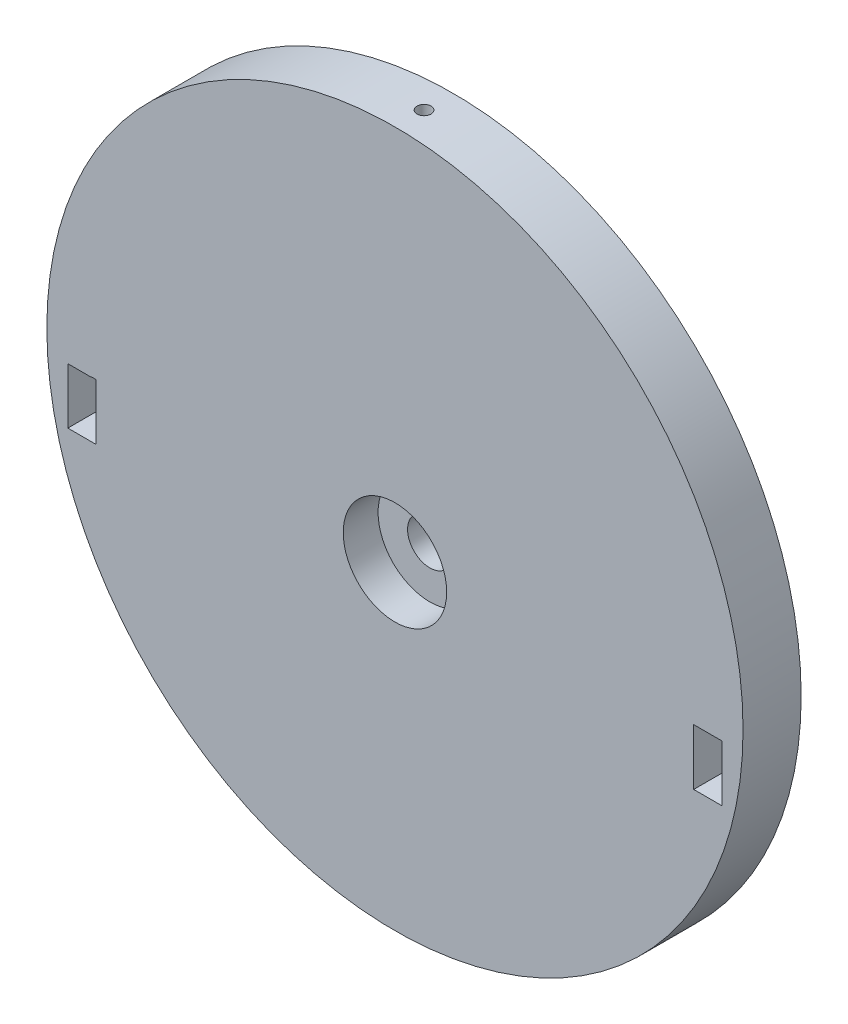
ISO-10303-21;
HEADER;
FILE_DESCRIPTION(('STEP AP214'),'2;1');
FILE_NAME('part.step','',(''),(''),'','','');
FILE_SCHEMA(('AUTOMOTIVE_DESIGN { 1 0 10303 214 1 1 1 1 }'));
ENDSEC;
DATA;
#1=APPLICATION_CONTEXT('core data for automotive mechanical design processes');
#2=APPLICATION_PROTOCOL_DEFINITION('international standard','automotive_design',2000,#1);
#3=PRODUCT_CONTEXT('',#1,'mechanical');
#4=PRODUCT('Part','Part','',(#3));
#5=PRODUCT_RELATED_PRODUCT_CATEGORY('part','',(#4));
#6=PRODUCT_DEFINITION_FORMATION('','',#4);
#7=PRODUCT_DEFINITION_CONTEXT('part definition',#1,'design');
#8=PRODUCT_DEFINITION('design','',#6,#7);
#9=PRODUCT_DEFINITION_SHAPE('','',#8);
#10=(LENGTH_UNIT() NAMED_UNIT(*) SI_UNIT(.MILLI.,.METRE.));
#11=(NAMED_UNIT(*) PLANE_ANGLE_UNIT() SI_UNIT($,.RADIAN.));
#12=(NAMED_UNIT(*) SI_UNIT($,.STERADIAN.) SOLID_ANGLE_UNIT());
#13=UNCERTAINTY_MEASURE_WITH_UNIT(LENGTH_MEASURE(1.E-05),#10,'distance_accuracy_value','');
#14=(GEOMETRIC_REPRESENTATION_CONTEXT(3) GLOBAL_UNCERTAINTY_ASSIGNED_CONTEXT((#13)) GLOBAL_UNIT_ASSIGNED_CONTEXT((#10,
#11,#12)) REPRESENTATION_CONTEXT('',''));
#15=CARTESIAN_POINT('',(0.,0.,0.));
#16=DIRECTION('',(0.,0.,1.));
#17=DIRECTION('',(1.,0.,0.));
#18=AXIS2_PLACEMENT_3D('',#15,#16,#17);
#19=CARTESIAN_POINT('',(0.,0.,12.7));
#20=DIRECTION('',(0.,0.,-1.));
#21=DIRECTION('',(-1.,0.,0.));
#22=AXIS2_PLACEMENT_3D('',#19,#20,#21);
#23=CYLINDRICAL_SURFACE('',#22,76.073);
#24=CARTESIAN_POINT('',(0.,76.073,7.874));
#25=CARTESIAN_POINT('',(-0.0855945349997395,76.0729997938981,7.8739962070841));
#26=CARTESIAN_POINT('',(-0.171250915498614,76.0728539877516,7.86676475231542));
#27=CARTESIAN_POINT('',(-0.34020402315075,76.0722863549378,7.8380177481725));
#28=CARTESIAN_POINT('',(-0.423497794593288,76.0718641971718,7.81648506395157));
#29=CARTESIAN_POINT('',(-0.585253568937349,76.0707916777908,7.75974939997557));
#30=CARTESIAN_POINT('',(-0.663717883442069,76.0701414263663,7.72455302018915));
#31=CARTESIAN_POINT('',(-0.813602096244805,76.0686861018941,7.6414983066732));
#32=CARTESIAN_POINT('',(-0.885023725956288,76.0678810670433,7.59364309576987));
#33=CARTESIAN_POINT('',(-1.01883757249064,76.0662065930215,7.48661238557633));
#34=CARTESIAN_POINT('',(-1.08122770917481,76.0653371390829,7.42743428565562));
#35=CARTESIAN_POINT('',(-1.19519031708527,76.0636319528676,7.29944138140923));
#36=CARTESIAN_POINT('',(-1.24676236082598,76.0627962219246,7.23062619644556));
#37=CARTESIAN_POINT('',(-1.3376251451231,76.0612526895481,7.08530858538175));
#38=CARTESIAN_POINT('',(-1.37691508154246,76.0605448964922,7.00880565638093));
#39=CARTESIAN_POINT('',(-1.44209293399731,76.0593371367803,6.85028787233994));
#40=CARTESIAN_POINT('',(-1.46798088892473,76.0588371695212,6.76827303329585));
#41=CARTESIAN_POINT('',(-1.50561666142446,76.0581015112436,6.60107112981486));
#42=CARTESIAN_POINT('',(-1.51736637556974,76.0578657847788,6.51588449243946));
#43=CARTESIAN_POINT('',(-1.52639796106279,76.0576850792755,6.34474758108269));
#44=CARTESIAN_POINT('',(-1.52367987260578,76.0577400994292,6.25879730922354));
#45=CARTESIAN_POINT('',(-1.50385466040847,76.058134649566,6.0885858285124));
#46=CARTESIAN_POINT('',(-1.48674959902126,76.0584741387708,6.00432437934235));
#47=CARTESIAN_POINT('',(-1.43863917290202,76.0593992901704,5.83986925639918));
#48=CARTESIAN_POINT('',(-1.40763378638577,76.0599849527511,5.75967558900121));
#49=CARTESIAN_POINT('',(-1.33260048235792,76.0613364724567,5.60562588607174));
#50=CARTESIAN_POINT('',(-1.28857161888797,76.0621023426703,5.53177031140958));
#51=CARTESIAN_POINT('',(-1.18874191287519,76.06372792186,5.39249838421378));
#52=CARTESIAN_POINT('',(-1.13294106097371,76.0645876309109,5.32708203838934));
#53=CARTESIAN_POINT('',(-1.01113968026977,76.0663041490692,5.20653346774724));
#54=CARTESIAN_POINT('',(-0.945137359360457,76.0671609576399,5.15140305363709));
#55=CARTESIAN_POINT('',(-0.804812955805773,76.068774934897,5.05300525410842));
#56=CARTESIAN_POINT('',(-0.730490871968146,76.069532103569,5.00973787038992));
#57=CARTESIAN_POINT('',(-0.575635722257035,76.0708614456781,4.93629456991411));
#58=CARTESIAN_POINT('',(-0.495102630444092,76.0714336183425,4.90611870783531));
#59=CARTESIAN_POINT('',(-0.330111987568198,76.0723284517307,4.85971619213728));
#60=CARTESIAN_POINT('',(-0.245654441366153,76.0726511127637,4.84348952124079));
#61=CARTESIAN_POINT('',(-0.0752280970382324,76.0730105092406,4.82544822325093));
#62=CARTESIAN_POINT('',(0.0107404358431765,76.0730472943758,4.82363109148176));
#63=CARTESIAN_POINT('',(0.181762198594427,76.0728309236548,4.83445393013134));
#64=CARTESIAN_POINT('',(0.266815428914037,76.0725777679412,4.84709389344572));
#65=CARTESIAN_POINT('',(0.433585227687397,76.0718100842554,4.88647004281087));
#66=CARTESIAN_POINT('',(0.515302064212906,76.071295577327,4.91320509394196));
#67=CARTESIAN_POINT('',(0.673087615387557,76.0700631847504,4.98001134307725));
#68=CARTESIAN_POINT('',(0.749156325373015,76.0693452989343,5.02008255209304));
#69=CARTESIAN_POINT('',(0.893497817923817,76.0677869317209,5.11243008364397));
#70=CARTESIAN_POINT('',(0.961769521065521,76.0669464333856,5.16470809305528));
#71=CARTESIAN_POINT('',(1.08856816644544,76.0652376414256,5.27998275581438));
#72=CARTESIAN_POINT('',(1.14709509541133,76.064369347763,5.34297942376068));
#73=CARTESIAN_POINT('',(1.25275113682792,76.062702713932,5.47791385714366));
#74=CARTESIAN_POINT('',(1.2998786325906,76.0619043836961,5.5498528886147));
#75=CARTESIAN_POINT('',(1.38138693581098,76.0604678399853,5.70062341316432));
#76=CARTESIAN_POINT('',(1.41576776354565,76.0598296262555,5.77945489527839));
#77=CARTESIAN_POINT('',(1.47080396987324,76.0587853412329,5.94176646382714));
#78=CARTESIAN_POINT('',(1.49146040078931,76.0583792521421,6.02524619332367));
#79=CARTESIAN_POINT('',(1.51846491163559,76.0578449503571,6.19448969847767));
#80=CARTESIAN_POINT('',(1.52481298287515,76.0577167378318,6.28025347552239));
#81=CARTESIAN_POINT('',(1.5230204201675,76.057752651535,6.45161418084123));
#82=CARTESIAN_POINT('',(1.51488234856612,76.0579167260631,6.53721113594226));
#83=CARTESIAN_POINT('',(1.4843537508379,76.0585186082872,6.70582368801636));
#84=CARTESIAN_POINT('',(1.46196319621411,76.0589564165305,6.78883927982783));
#85=CARTESIAN_POINT('',(1.40356528137836,76.0600564074551,6.94993429709386));
#86=CARTESIAN_POINT('',(1.36755767518964,76.0607185941895,7.02801363335077));
#87=CARTESIAN_POINT('',(1.28294952090296,76.0621926572606,7.17701646717216));
#88=CARTESIAN_POINT('',(1.23434944982934,76.0630045279267,7.24794023566054));
#89=CARTESIAN_POINT('',(1.12593166801518,76.0646865379788,7.38062841617391));
#90=CARTESIAN_POINT('',(1.06611316687766,76.0655566814677,7.44239218227948));
#91=CARTESIAN_POINT('',(0.936938606354715,76.0672573317802,7.55501670462068));
#92=CARTESIAN_POINT('',(0.867580184106197,76.0680878287152,7.60587475169931));
#93=CARTESIAN_POINT('',(0.721275855637613,76.069615757486,7.6952481771298));
#94=CARTESIAN_POINT('',(0.644325772223449,76.0703131154378,7.73375671026321));
#95=CARTESIAN_POINT('',(0.485111216277929,76.0714947092142,7.79726362145155));
#96=CARTESIAN_POINT('',(0.402853232344318,76.0719791998013,7.82227815751565));
#97=CARTESIAN_POINT('',(0.266727553014035,76.0725505644765,7.85143693908694));
#98=CARTESIAN_POINT('',(0.213743956090708,76.0727183744292,7.8598874886381));
#99=CARTESIAN_POINT('',(0.10718165758212,76.0729431567187,7.87117020637344));
#100=CARTESIAN_POINT('',(0.0536029560740152,76.0730001290698,7.87400237528604));
#101=CARTESIAN_POINT('',(0.,76.073,7.874));
#102=B_SPLINE_CURVE_WITH_KNOTS('',3,(#24,#25,#26,#27,#28,#29,#30,#31,#32,#33,#34,#35,#36,#37,
#38,#39,#40,#41,#42,#43,#44,#45,#46,#47,#48,#49,#50,#51,#52,#53,#54,#55,#56,#57,#58,#59,#60,#61,
#62,#63,#64,#65,#66,#67,#68,#69,#70,#71,#72,#73,#74,#75,#76,#77,#78,#79,#80,#81,#82,#83,#84,#85,
#86,#87,#88,#89,#90,#91,#92,#93,#94,#95,#96,#97,#98,#99,#100,#101),.UNSPECIFIED.,.T.,.F.,(4,2,2,
2,2,2,2,2,2,2,2,2,2,2,2,2,2,2,2,2,2,2,2,2,2,2,2,2,2,2,2,2,2,2,2,2,2,2,4),(0.,0.256587951195914,
0.513483886104432,0.770255886772823,1.02696460294593,1.28373235066598,1.5405102428578,
1.79730494335351,2.0540988986388,2.31085840248152,2.56761719298187,2.82433918372928,
3.08106157680606,3.33780262145724,3.59454387021671,3.85133027245316,4.10811671148822,
4.36490422301618,4.62169141649049,4.87843397406324,5.13517640547004,5.3918981674388,
5.64862014138162,5.90537761313974,6.16213543459716,6.41892964858623,6.67572345407407,
6.9324975675299,7.18927183694584,7.44600069198828,7.70273006034533,7.95946406645213,
8.21618834845273,8.47293072481965,8.72973680644863,8.98668498820557,9.24332480772159,
9.40401117000276,9.56469751145106),.UNSPECIFIED.);
#103=CARTESIAN_POINT('',(0.,76.073,7.874));
#104=VERTEX_POINT('',#103);
#105=EDGE_CURVE('E48',#104,#104,#102,.T.);
#106=ORIENTED_EDGE('',*,*,#105,.T.);
#107=EDGE_LOOP('',(#106));
#108=FACE_BOUND('',#107,.T.);
#109=CARTESIAN_POINT('',(0.,0.,12.7));
#110=DIRECTION('',(0.,0.,1.));
#111=DIRECTION('',(1.,0.,0.));
#112=AXIS2_PLACEMENT_3D('',#109,#110,#111);
#113=CIRCLE('',#112,76.073);
#114=CARTESIAN_POINT('',(76.073,0.,12.7));
#115=VERTEX_POINT('',#114);
#116=EDGE_CURVE('E208',#115,#115,#113,.T.);
#117=ORIENTED_EDGE('',*,*,#116,.F.);
#118=EDGE_LOOP('',(#117));
#119=FACE_BOUND('',#118,.T.);
#120=CARTESIAN_POINT('',(0.,0.,0.));
#121=DIRECTION('',(0.,0.,1.));
#122=DIRECTION('',(1.,0.,0.));
#123=AXIS2_PLACEMENT_3D('',#120,#121,#122);
#124=CIRCLE('',#123,76.073);
#125=CARTESIAN_POINT('',(76.073,0.,0.));
#126=VERTEX_POINT('',#125);
#127=EDGE_CURVE('E207',#126,#126,#124,.T.);
#128=ORIENTED_EDGE('',*,*,#127,.T.);
#129=EDGE_LOOP('',(#128));
#130=FACE_BOUND('',#129,.T.);
#131=CARTESIAN_POINT('',(0.,-76.073,4.826));
#132=CARTESIAN_POINT('',(0.0855945349997394,-76.0729997938981,4.8260037929159));
#133=CARTESIAN_POINT('',(0.171250915498614,-76.0728539877516,4.83323524768458));
#134=CARTESIAN_POINT('',(0.340204023150751,-76.0722863549378,4.8619822518275));
#135=CARTESIAN_POINT('',(0.423497794593289,-76.0718641971718,4.88351493604843));
#136=CARTESIAN_POINT('',(0.585253568937349,-76.0707916777908,4.94025060002443));
#137=CARTESIAN_POINT('',(0.663717883442069,-76.0701414263663,4.97544697981085));
#138=CARTESIAN_POINT('',(0.813602096244805,-76.0686861018941,5.0585016933268));
#139=CARTESIAN_POINT('',(0.885023725956288,-76.0678810670433,5.10635690423013));
#140=CARTESIAN_POINT('',(1.01883757249064,-76.0662065930215,5.21338761442367));
#141=CARTESIAN_POINT('',(1.08122770917481,-76.0653371390829,5.27256571434438));
#142=CARTESIAN_POINT('',(1.19519031708527,-76.0636319528676,5.40055861859078));
#143=CARTESIAN_POINT('',(1.24676236082598,-76.0627962219246,5.46937380355444));
#144=CARTESIAN_POINT('',(1.3376251451231,-76.0612526895481,5.61469141461825));
#145=CARTESIAN_POINT('',(1.37691508154246,-76.0605448964922,5.69119434361907));
#146=CARTESIAN_POINT('',(1.44209293399731,-76.0593371367803,5.84971212766006));
#147=CARTESIAN_POINT('',(1.46798088892473,-76.0588371695212,5.93172696670415));
#148=CARTESIAN_POINT('',(1.50561666142446,-76.0581015112436,6.09892887018514));
#149=CARTESIAN_POINT('',(1.51736637556974,-76.0578657847788,6.18411550756054));
#150=CARTESIAN_POINT('',(1.52639796106279,-76.0576850792755,6.35525241891731));
#151=CARTESIAN_POINT('',(1.52367987260578,-76.0577400994292,6.44120269077646));
#152=CARTESIAN_POINT('',(1.50385466040847,-76.058134649566,6.6114141714876));
#153=CARTESIAN_POINT('',(1.48674959902126,-76.0584741387708,6.69567562065765));
#154=CARTESIAN_POINT('',(1.43863917290202,-76.0593992901704,6.86013074360081));
#155=CARTESIAN_POINT('',(1.40763378638577,-76.0599849527511,6.94032441099879));
#156=CARTESIAN_POINT('',(1.33260048235792,-76.0613364724567,7.09437411392826));
#157=CARTESIAN_POINT('',(1.28857161888797,-76.0621023426703,7.16822968859042));
#158=CARTESIAN_POINT('',(1.18874191287519,-76.06372792186,7.30750161578622));
#159=CARTESIAN_POINT('',(1.13294106097371,-76.0645876309109,7.37291796161066));
#160=CARTESIAN_POINT('',(1.01113968026977,-76.0663041490692,7.49346653225276));
#161=CARTESIAN_POINT('',(0.945137359360457,-76.0671609576399,7.54859694636291));
#162=CARTESIAN_POINT('',(0.804812955805773,-76.068774934897,7.64699474589158));
#163=CARTESIAN_POINT('',(0.730490871968146,-76.069532103569,7.69026212961008));
#164=CARTESIAN_POINT('',(0.575635722257035,-76.0708614456781,7.76370543008589));
#165=CARTESIAN_POINT('',(0.495102630444092,-76.0714336183425,7.79388129216469));
#166=CARTESIAN_POINT('',(0.330111987568197,-76.0723284517307,7.84028380786272));
#167=CARTESIAN_POINT('',(0.245654441366152,-76.0726511127637,7.85651047875921));
#168=CARTESIAN_POINT('',(0.0752280970382317,-76.0730105092406,7.87455177674907));
#169=CARTESIAN_POINT('',(-0.0107404358431773,-76.0730472943758,7.87636890851824));
#170=CARTESIAN_POINT('',(-0.181762198594428,-76.0728309236548,7.86554606986866));
#171=CARTESIAN_POINT('',(-0.266815428914038,-76.0725777679412,7.85290610655428));
#172=CARTESIAN_POINT('',(-0.433585227687398,-76.0718100842554,7.81352995718914));
#173=CARTESIAN_POINT('',(-0.515302064212906,-76.071295577327,7.78679490605804));
#174=CARTESIAN_POINT('',(-0.673087615387558,-76.0700631847504,7.71998865692275));
#175=CARTESIAN_POINT('',(-0.749156325373015,-76.0693452989343,7.67991744790696));
#176=CARTESIAN_POINT('',(-0.893497817923817,-76.0677869317209,7.58756991635603));
#177=CARTESIAN_POINT('',(-0.961769521065521,-76.0669464333856,7.53529190694472));
#178=CARTESIAN_POINT('',(-1.08856816644544,-76.0652376414256,7.42001724418562));
#179=CARTESIAN_POINT('',(-1.14709509541133,-76.064369347763,7.35702057623932));
#180=CARTESIAN_POINT('',(-1.25275113682792,-76.062702713932,7.22208614285634));
#181=CARTESIAN_POINT('',(-1.2998786325906,-76.0619043836961,7.1501471113853));
#182=CARTESIAN_POINT('',(-1.38138693581098,-76.0604678399853,6.99937658683568));
#183=CARTESIAN_POINT('',(-1.41576776354565,-76.0598296262555,6.92054510472161));
#184=CARTESIAN_POINT('',(-1.47080396987324,-76.0587853412329,6.75823353617286));
#185=CARTESIAN_POINT('',(-1.49146040078931,-76.0583792521421,6.67475380667633));
#186=CARTESIAN_POINT('',(-1.51846491163559,-76.0578449503571,6.50551030152233));
#187=CARTESIAN_POINT('',(-1.52481298287515,-76.0577167378318,6.41974652447761));
#188=CARTESIAN_POINT('',(-1.5230204201675,-76.057752651535,6.24838581915876));
#189=CARTESIAN_POINT('',(-1.51488234856612,-76.0579167260631,6.16278886405774));
#190=CARTESIAN_POINT('',(-1.4843537508379,-76.0585186082872,5.99417631198364));
#191=CARTESIAN_POINT('',(-1.46196319621411,-76.0589564165305,5.91116072017217));
#192=CARTESIAN_POINT('',(-1.40356528137836,-76.0600564074551,5.75006570290614));
#193=CARTESIAN_POINT('',(-1.36755767518963,-76.0607185941895,5.67198636664923));
#194=CARTESIAN_POINT('',(-1.28294952090296,-76.0621926572606,5.52298353282783));
#195=CARTESIAN_POINT('',(-1.23434944982934,-76.0630045279267,5.45205976433946));
#196=CARTESIAN_POINT('',(-1.12593166801518,-76.0646865379788,5.31937158382608));
#197=CARTESIAN_POINT('',(-1.06611316687766,-76.0655566814677,5.25760781772052));
#198=CARTESIAN_POINT('',(-0.936938606354714,-76.0672573317802,5.14498329537932));
#199=CARTESIAN_POINT('',(-0.867580184106196,-76.0680878287152,5.09412524830069));
#200=CARTESIAN_POINT('',(-0.721275855637612,-76.069615757486,5.00475182287019));
#201=CARTESIAN_POINT('',(-0.644325772223447,-76.0703131154378,4.96624328973679));
#202=CARTESIAN_POINT('',(-0.485111216277928,-76.0714947092142,4.90273637854845));
#203=CARTESIAN_POINT('',(-0.402853232344318,-76.0719791998013,4.87772184248435));
#204=CARTESIAN_POINT('',(-0.266727553014035,-76.0725505644765,4.84856306091306));
#205=CARTESIAN_POINT('',(-0.213743956090708,-76.0727183744292,4.8401125113619));
#206=CARTESIAN_POINT('',(-0.10718165758212,-76.0729431567187,4.82882979362655));
#207=CARTESIAN_POINT('',(-0.0536029560740151,-76.0730001290698,4.82599762471396));
#208=CARTESIAN_POINT('',(0.,-76.073,4.826));
#209=B_SPLINE_CURVE_WITH_KNOTS('',3,(#131,#132,#133,#134,#135,#136,#137,#138,#139,#140,#141,
#142,#143,#144,#145,#146,#147,#148,#149,#150,#151,#152,#153,#154,#155,#156,#157,#158,#159,#160,
#161,#162,#163,#164,#165,#166,#167,#168,#169,#170,#171,#172,#173,#174,#175,#176,#177,#178,#179,
#180,#181,#182,#183,#184,#185,#186,#187,#188,#189,#190,#191,#192,#193,#194,#195,#196,#197,#198,
#199,#200,#201,#202,#203,#204,#205,#206,#207,#208),.UNSPECIFIED.,.T.,.F.,(4,2,2,2,2,2,2,2,2,2,2,
2,2,2,2,2,2,2,2,2,2,2,2,2,2,2,2,2,2,2,2,2,2,2,2,2,2,2,4),(0.,0.256587951195914,
0.513483886104433,0.770255886772824,1.02696460294593,1.28373235066598,1.5405102428578,
1.79730494335351,2.0540988986388,2.31085840248152,2.56761719298187,2.82433918372928,
3.08106157680606,3.33780262145724,3.59454387021671,3.85133027245316,4.10811671148822,
4.36490422301619,4.62169141649049,4.87843397406324,5.13517640547004,5.3918981674388,
5.64862014138162,5.90537761313974,6.16213543459716,6.41892964858622,6.67572345407407,
6.9324975675299,7.18927183694584,7.44600069198828,7.70273006034533,7.95946406645213,
8.21618834845273,8.47293072481965,8.72973680644863,8.98668498820558,9.24332480772159,
9.40401117000276,9.56469751145106),.UNSPECIFIED.);
#210=CARTESIAN_POINT('',(0.,-76.073,4.826));
#211=VERTEX_POINT('',#210);
#212=EDGE_CURVE('E11',#211,#211,#209,.T.);
#213=ORIENTED_EDGE('',*,*,#212,.F.);
#214=EDGE_LOOP('',(#213));
#215=FACE_BOUND('',#214,.T.);
#216=ADVANCED_FACE('F36',(#108,#119,#130,#215),#23,.T.);
#217=CARTESIAN_POINT('',(0.,-6.35,12.7));
#218=DIRECTION('',(0.,0.,-1.));
#219=DIRECTION('',(-1.,0.,0.));
#220=AXIS2_PLACEMENT_3D('',#217,#218,#219);
#221=CYLINDRICAL_SURFACE('',#220,4.8641);
#222=CARTESIAN_POINT('',(0.,-6.35,0.));
#223=DIRECTION('',(0.,0.,1.));
#224=DIRECTION('',(1.,0.,0.));
#225=AXIS2_PLACEMENT_3D('',#222,#223,#224);
#226=CIRCLE('',#225,4.8641);
#227=CARTESIAN_POINT('',(4.8641,-6.35,0.));
#228=VERTEX_POINT('',#227);
#229=EDGE_CURVE('E169',#228,#228,#226,.T.);
#230=ORIENTED_EDGE('',*,*,#229,.F.);
#231=EDGE_LOOP('',(#230));
#232=FACE_BOUND('',#231,.T.);
#233=CARTESIAN_POINT('',(0.,-6.35,5.08));
#234=DIRECTION('',(0.,0.,1.));
#235=DIRECTION('',(1.,0.,0.));
#236=AXIS2_PLACEMENT_3D('',#233,#234,#235);
#237=CIRCLE('',#236,4.8641);
#238=CARTESIAN_POINT('',(4.8641,-6.35,5.08));
#239=VERTEX_POINT('',#238);
#240=EDGE_CURVE('E191',#239,#239,#237,.T.);
#241=ORIENTED_EDGE('',*,*,#240,.T.);
#242=EDGE_LOOP('',(#241));
#243=FACE_BOUND('',#242,.T.);
#244=ADVANCED_FACE('F270',(#232,#243),#221,.F.);
#245=CARTESIAN_POINT('',(0.,0.,12.7));
#246=DIRECTION('',(0.,0.,1.));
#247=DIRECTION('',(1.,0.,0.));
#248=AXIS2_PLACEMENT_3D('',#245,#246,#247);
#249=PLANE('',#248);
#250=CARTESIAN_POINT('',(0.,-6.35,12.7));
#251=DIRECTION('',(0.,0.,1.));
#252=DIRECTION('',(1.,0.,0.));
#253=AXIS2_PLACEMENT_3D('',#250,#251,#252);
#254=CIRCLE('',#253,11.303);
#255=CARTESIAN_POINT('',(11.303,-6.35,12.7));
#256=VERTEX_POINT('',#255);
#257=EDGE_CURVE('E145',#256,#256,#254,.T.);
#258=ORIENTED_EDGE('',*,*,#257,.F.);
#259=EDGE_LOOP('',(#258));
#260=FACE_BOUND('',#259,.T.);
#261=DIRECTION('',(1.,0.,0.));
#262=VECTOR('',#261,1.);
#263=CARTESIAN_POINT('',(0.,-16.6878,12.7));
#264=LINE('',#263,#262);
#265=CARTESIAN_POINT('',(-71.4839714003076,-16.6878,12.7));
#266=VERTEX_POINT('',#265);
#267=CARTESIAN_POINT('',(-65.2863714003076,-16.6878,12.7));
#268=VERTEX_POINT('',#267);
#269=EDGE_CURVE('E55',#266,#268,#264,.T.);
#270=ORIENTED_EDGE('',*,*,#269,.F.);
#271=DIRECTION('',(0.,1.,0.));
#272=VECTOR('',#271,1.);
#273=CARTESIAN_POINT('',(-71.4839714003076,0.,12.7));
#274=LINE('',#273,#272);
#275=CARTESIAN_POINT('',(-71.4839714003076,-4.4958,12.7));
#276=VERTEX_POINT('',#275);
#277=EDGE_CURVE('E139',#266,#276,#274,.T.);
#278=ORIENTED_EDGE('',*,*,#277,.T.);
#279=DIRECTION('',(1.,0.,0.));
#280=VECTOR('',#279,1.);
#281=CARTESIAN_POINT('',(0.,-4.4958,12.7));
#282=LINE('',#281,#280);
#283=CARTESIAN_POINT('',(-66.3573603731963,-4.4958,12.7));
#284=VERTEX_POINT('',#283);
#285=EDGE_CURVE('E142',#276,#284,#282,.T.);
#286=ORIENTED_EDGE('',*,*,#285,.T.);
#287=DIRECTION('',(0.,-1.,0.));
#288=VECTOR('',#287,1.);
#289=CARTESIAN_POINT('',(-66.3573603731962,1.6386731914158E-12,12.7));
#290=LINE('',#289,#288);
#291=CARTESIAN_POINT('',(-66.3573603731963,-4.41959999999999,12.7));
#292=VERTEX_POINT('',#291);
#293=EDGE_CURVE('E162',#292,#284,#290,.T.);
#294=ORIENTED_EDGE('',*,*,#293,.F.);
#295=DIRECTION('',(1.,0.,0.));
#296=VECTOR('',#295,1.);
#297=CARTESIAN_POINT('',(0.,-4.41959999999999,12.7));
#298=LINE('',#297,#296);
#299=CARTESIAN_POINT('',(-65.2863714003076,-4.41959999999999,12.7));
#300=VERTEX_POINT('',#299);
#301=EDGE_CURVE('E159',#292,#300,#298,.T.);
#302=ORIENTED_EDGE('',*,*,#301,.T.);
#303=DIRECTION('',(0.,1.,0.));
#304=VECTOR('',#303,1.);
#305=CARTESIAN_POINT('',(-65.2863714003076,0.,12.7));
#306=LINE('',#305,#304);
#307=EDGE_CURVE('E156',#268,#300,#306,.T.);
#308=ORIENTED_EDGE('',*,*,#307,.F.);
#309=EDGE_LOOP('',(#270,#278,#286,#294,#302,#308));
#310=FACE_BOUND('',#309,.T.);
#311=ORIENTED_EDGE('',*,*,#116,.T.);
#312=EDGE_LOOP('',(#311));
#313=FACE_BOUND('',#312,.T.);
#314=DIRECTION('',(0.,1.,0.));
#315=VECTOR('',#314,1.);
#316=CARTESIAN_POINT('',(71.4839714003076,0.,12.7));
#317=LINE('',#316,#315);
#318=CARTESIAN_POINT('',(71.4839714003076,-16.6878,12.7));
#319=VERTEX_POINT('',#318);
#320=CARTESIAN_POINT('',(71.4839714003076,-4.41959999999998,12.7));
#321=VERTEX_POINT('',#320);
#322=EDGE_CURVE('E190',#319,#321,#317,.T.);
#323=ORIENTED_EDGE('',*,*,#322,.F.);
#324=DIRECTION('',(-1.,0.,0.));
#325=VECTOR('',#324,1.);
#326=CARTESIAN_POINT('',(0.,-16.6877999999998,12.7));
#327=LINE('',#326,#325);
#328=CARTESIAN_POINT('',(65.2863714003076,-16.6878,12.7));
#329=VERTEX_POINT('',#328);
#330=EDGE_CURVE('E63',#319,#329,#327,.T.);
#331=ORIENTED_EDGE('',*,*,#330,.T.);
#332=DIRECTION('',(0.,1.,0.));
#333=VECTOR('',#332,1.);
#334=CARTESIAN_POINT('',(65.2863714003076,0.,12.7));
#335=LINE('',#334,#333);
#336=CARTESIAN_POINT('',(65.2863714003076,-4.41959999999998,12.7));
#337=VERTEX_POINT('',#336);
#338=EDGE_CURVE('E180',#329,#337,#335,.T.);
#339=ORIENTED_EDGE('',*,*,#338,.T.);
#340=DIRECTION('',(-1.,0.,0.));
#341=VECTOR('',#340,1.);
#342=CARTESIAN_POINT('',(0.,-4.41959999999999,12.7));
#343=LINE('',#342,#341);
#344=EDGE_CURVE('E194',#321,#337,#343,.T.);
#345=ORIENTED_EDGE('',*,*,#344,.F.);
#346=EDGE_LOOP('',(#323,#331,#339,#345));
#347=FACE_BOUND('',#346,.T.);
#348=ADVANCED_FACE('F273',(#260,#310,#313,#347),#249,.T.);
#349=CARTESIAN_POINT('',(0.,0.,0.));
#350=DIRECTION('',(0.,0.,1.));
#351=DIRECTION('',(1.,0.,0.));
#352=AXIS2_PLACEMENT_3D('',#349,#350,#351);
#353=PLANE('',#352);
#354=DIRECTION('',(0.,1.,0.));
#355=VECTOR('',#354,1.);
#356=CARTESIAN_POINT('',(-71.4839714003076,0.,0.));
#357=LINE('',#356,#355);
#358=CARTESIAN_POINT('',(-71.4839714003076,-16.6878,0.));
#359=VERTEX_POINT('',#358);
#360=CARTESIAN_POINT('',(-71.4839714003076,-4.4958,0.));
#361=VERTEX_POINT('',#360);
#362=EDGE_CURVE('E126',#359,#361,#357,.T.);
#363=ORIENTED_EDGE('',*,*,#362,.F.);
#364=DIRECTION('',(1.,0.,0.));
#365=VECTOR('',#364,1.);
#366=CARTESIAN_POINT('',(0.,-16.6878,0.));
#367=LINE('',#366,#365);
#368=CARTESIAN_POINT('',(-65.2863714003076,-16.6878,0.));
#369=VERTEX_POINT('',#368);
#370=EDGE_CURVE('E120',#359,#369,#367,.T.);
#371=ORIENTED_EDGE('',*,*,#370,.T.);
#372=DIRECTION('',(0.,1.,0.));
#373=VECTOR('',#372,1.);
#374=CARTESIAN_POINT('',(-65.2863714003076,0.,0.));
#375=LINE('',#374,#373);
#376=CARTESIAN_POINT('',(-65.2863714003076,-4.41959999999999,0.));
#377=VERTEX_POINT('',#376);
#378=EDGE_CURVE('E129',#369,#377,#375,.T.);
#379=ORIENTED_EDGE('',*,*,#378,.T.);
#380=DIRECTION('',(1.,0.,0.));
#381=VECTOR('',#380,1.);
#382=CARTESIAN_POINT('',(0.,-4.41959999999999,0.));
#383=LINE('',#382,#381);
#384=CARTESIAN_POINT('',(-66.3573603731963,-4.41959999999999,0.));
#385=VERTEX_POINT('',#384);
#386=EDGE_CURVE('E134',#385,#377,#383,.T.);
#387=ORIENTED_EDGE('',*,*,#386,.F.);
#388=DIRECTION('',(0.,-1.,0.));
#389=VECTOR('',#388,1.);
#390=CARTESIAN_POINT('',(-66.3573603731962,1.6386731914158E-12,0.));
#391=LINE('',#390,#389);
#392=CARTESIAN_POINT('',(-66.3573603731963,-4.4958,0.));
#393=VERTEX_POINT('',#392);
#394=EDGE_CURVE('E149',#385,#393,#391,.T.);
#395=ORIENTED_EDGE('',*,*,#394,.T.);
#396=DIRECTION('',(1.,0.,0.));
#397=VECTOR('',#396,1.);
#398=CARTESIAN_POINT('',(0.,-4.4958,0.));
#399=LINE('',#398,#397);
#400=EDGE_CURVE('E152',#361,#393,#399,.T.);
#401=ORIENTED_EDGE('',*,*,#400,.F.);
#402=EDGE_LOOP('',(#363,#371,#379,#387,#395,#401));
#403=FACE_BOUND('',#402,.T.);
#404=ORIENTED_EDGE('',*,*,#229,.T.);
#405=EDGE_LOOP('',(#404));
#406=FACE_BOUND('',#405,.T.);
#407=ORIENTED_EDGE('',*,*,#127,.F.);
#408=EDGE_LOOP('',(#407));
#409=FACE_BOUND('',#408,.T.);
#410=DIRECTION('',(-1.,0.,0.));
#411=VECTOR('',#410,1.);
#412=CARTESIAN_POINT('',(0.,-16.6877999999998,0.));
#413=LINE('',#412,#411);
#414=CARTESIAN_POINT('',(71.4839714003076,-16.6878,0.));
#415=VERTEX_POINT('',#414);
#416=CARTESIAN_POINT('',(65.2863714003076,-16.6878,0.));
#417=VERTEX_POINT('',#416);
#418=EDGE_CURVE('E177',#415,#417,#413,.T.);
#419=ORIENTED_EDGE('',*,*,#418,.F.);
#420=DIRECTION('',(0.,1.,0.));
#421=VECTOR('',#420,1.);
#422=CARTESIAN_POINT('',(71.4839714003076,0.,0.));
#423=LINE('',#422,#421);
#424=CARTESIAN_POINT('',(71.4839714003076,-4.41959999999998,0.));
#425=VERTEX_POINT('',#424);
#426=EDGE_CURVE('E179',#415,#425,#423,.T.);
#427=ORIENTED_EDGE('',*,*,#426,.T.);
#428=DIRECTION('',(-1.,0.,0.));
#429=VECTOR('',#428,1.);
#430=CARTESIAN_POINT('',(0.,-4.41959999999999,0.));
#431=LINE('',#430,#429);
#432=CARTESIAN_POINT('',(65.2863714003076,-4.41959999999998,0.));
#433=VERTEX_POINT('',#432);
#434=EDGE_CURVE('E183',#425,#433,#431,.T.);
#435=ORIENTED_EDGE('',*,*,#434,.T.);
#436=DIRECTION('',(0.,1.,0.));
#437=VECTOR('',#436,1.);
#438=CARTESIAN_POINT('',(65.2863714003076,0.,0.));
#439=LINE('',#438,#437);
#440=EDGE_CURVE('E186',#417,#433,#439,.T.);
#441=ORIENTED_EDGE('',*,*,#440,.F.);
#442=EDGE_LOOP('',(#419,#427,#435,#441));
#443=FACE_BOUND('',#442,.T.);
#444=ADVANCED_FACE('F136',(#403,#406,#409,#443),#353,.F.);
#445=CARTESIAN_POINT('',(0.,-16.6877999999998,0.));
#446=DIRECTION('',(0.,1.,0.));
#447=DIRECTION('',(-1.,0.,0.));
#448=AXIS2_PLACEMENT_3D('',#445,#446,#447);
#449=PLANE('',#448);
#450=ORIENTED_EDGE('',*,*,#330,.F.);
#451=DIRECTION('',(0.,0.,1.));
#452=VECTOR('',#451,1.);
#453=CARTESIAN_POINT('',(71.4839714003076,-16.6878,0.));
#454=LINE('',#453,#452);
#455=EDGE_CURVE('E188',#415,#319,#454,.T.);
#456=ORIENTED_EDGE('',*,*,#455,.F.);
#457=ORIENTED_EDGE('',*,*,#418,.T.);
#458=DIRECTION('',(0.,0.,1.));
#459=VECTOR('',#458,1.);
#460=CARTESIAN_POINT('',(65.2863714003076,-16.6878,0.));
#461=LINE('',#460,#459);
#462=EDGE_CURVE('E157',#417,#329,#461,.T.);
#463=ORIENTED_EDGE('',*,*,#462,.T.);
#464=EDGE_LOOP('',(#450,#456,#457,#463));
#465=FACE_BOUND('',#464,.T.);
#466=ADVANCED_FACE('F260',(#465),#449,.T.);
#467=CARTESIAN_POINT('',(65.2863714003076,0.,0.));
#468=DIRECTION('',(1.,0.,0.));
#469=DIRECTION('',(0.,0.,-1.));
#470=AXIS2_PLACEMENT_3D('',#467,#468,#469);
#471=PLANE('',#470);
#472=ORIENTED_EDGE('',*,*,#338,.F.);
#473=ORIENTED_EDGE('',*,*,#462,.F.);
#474=ORIENTED_EDGE('',*,*,#440,.T.);
#475=DIRECTION('',(0.,0.,1.));
#476=VECTOR('',#475,1.);
#477=CARTESIAN_POINT('',(65.2863714003076,-4.41959999999998,0.));
#478=LINE('',#477,#476);
#479=EDGE_CURVE('E200',#433,#337,#478,.T.);
#480=ORIENTED_EDGE('',*,*,#479,.T.);
#481=EDGE_LOOP('',(#472,#473,#474,#480));
#482=FACE_BOUND('',#481,.T.);
#483=ADVANCED_FACE('F256',(#482),#471,.T.);
#484=CARTESIAN_POINT('',(0.,-4.41959999999999,0.));
#485=DIRECTION('',(0.,1.,0.));
#486=DIRECTION('',(-1.,0.,0.));
#487=AXIS2_PLACEMENT_3D('',#484,#485,#486);
#488=PLANE('',#487);
#489=ORIENTED_EDGE('',*,*,#344,.T.);
#490=ORIENTED_EDGE('',*,*,#479,.F.);
#491=ORIENTED_EDGE('',*,*,#434,.F.);
#492=DIRECTION('',(0.,0.,1.));
#493=VECTOR('',#492,1.);
#494=CARTESIAN_POINT('',(71.4839714003076,-4.41959999999998,0.));
#495=LINE('',#494,#493);
#496=EDGE_CURVE('E202',#425,#321,#495,.T.);
#497=ORIENTED_EDGE('',*,*,#496,.T.);
#498=EDGE_LOOP('',(#489,#490,#491,#497));
#499=FACE_BOUND('',#498,.T.);
#500=ADVANCED_FACE('F259',(#499),#488,.F.);
#501=CARTESIAN_POINT('',(71.4839714003076,0.,0.));
#502=DIRECTION('',(1.,0.,0.));
#503=DIRECTION('',(0.,0.,-1.));
#504=AXIS2_PLACEMENT_3D('',#501,#502,#503);
#505=PLANE('',#504);
#506=ORIENTED_EDGE('',*,*,#322,.T.);
#507=ORIENTED_EDGE('',*,*,#496,.F.);
#508=ORIENTED_EDGE('',*,*,#426,.F.);
#509=ORIENTED_EDGE('',*,*,#455,.T.);
#510=EDGE_LOOP('',(#506,#507,#508,#509));
#511=FACE_BOUND('',#510,.T.);
#512=ADVANCED_FACE('F255',(#511),#505,.F.);
#513=CARTESIAN_POINT('',(0.,-16.6878,0.));
#514=DIRECTION('',(0.,-1.,0.));
#515=DIRECTION('',(0.,0.,-1.));
#516=AXIS2_PLACEMENT_3D('',#513,#514,#515);
#517=PLANE('',#516);
#518=ORIENTED_EDGE('',*,*,#269,.T.);
#519=DIRECTION('',(0.,0.,1.));
#520=VECTOR('',#519,1.);
#521=CARTESIAN_POINT('',(-65.2863714003076,-16.6878,0.));
#522=LINE('',#521,#520);
#523=EDGE_CURVE('E116',#369,#268,#522,.T.);
#524=ORIENTED_EDGE('',*,*,#523,.F.);
#525=ORIENTED_EDGE('',*,*,#370,.F.);
#526=DIRECTION('',(0.,0.,1.));
#527=VECTOR('',#526,1.);
#528=CARTESIAN_POINT('',(-71.4839714003076,-16.6878,0.));
#529=LINE('',#528,#527);
#530=EDGE_CURVE('E167',#359,#266,#529,.T.);
#531=ORIENTED_EDGE('',*,*,#530,.T.);
#532=EDGE_LOOP('',(#518,#524,#525,#531));
#533=FACE_BOUND('',#532,.T.);
#534=ADVANCED_FACE('F118',(#533),#517,.F.);
#535=CARTESIAN_POINT('',(-71.4839714003076,0.,0.));
#536=DIRECTION('',(1.,0.,0.));
#537=DIRECTION('',(0.,0.,-1.));
#538=AXIS2_PLACEMENT_3D('',#535,#536,#537);
#539=PLANE('',#538);
#540=ORIENTED_EDGE('',*,*,#277,.F.);
#541=ORIENTED_EDGE('',*,*,#530,.F.);
#542=ORIENTED_EDGE('',*,*,#362,.T.);
#543=DIRECTION('',(0.,0.,1.));
#544=VECTOR('',#543,1.);
#545=CARTESIAN_POINT('',(-71.4839714003076,-4.4958,0.));
#546=LINE('',#545,#544);
#547=EDGE_CURVE('E170',#361,#276,#546,.T.);
#548=ORIENTED_EDGE('',*,*,#547,.T.);
#549=EDGE_LOOP('',(#540,#541,#542,#548));
#550=FACE_BOUND('',#549,.T.);
#551=ADVANCED_FACE('F235',(#550),#539,.T.);
#552=CARTESIAN_POINT('',(0.,-4.4958,0.));
#553=DIRECTION('',(0.,-1.,0.));
#554=DIRECTION('',(0.,0.,-1.));
#555=AXIS2_PLACEMENT_3D('',#552,#553,#554);
#556=PLANE('',#555);
#557=ORIENTED_EDGE('',*,*,#285,.F.);
#558=ORIENTED_EDGE('',*,*,#547,.F.);
#559=ORIENTED_EDGE('',*,*,#400,.T.);
#560=DIRECTION('',(0.,0.,1.));
#561=VECTOR('',#560,1.);
#562=CARTESIAN_POINT('',(-66.3573603731963,-4.4958,0.));
#563=LINE('',#562,#561);
#564=EDGE_CURVE('E172',#393,#284,#563,.T.);
#565=ORIENTED_EDGE('',*,*,#564,.T.);
#566=EDGE_LOOP('',(#557,#558,#559,#565));
#567=FACE_BOUND('',#566,.T.);
#568=ADVANCED_FACE('F238',(#567),#556,.T.);
#569=CARTESIAN_POINT('',(-66.3573603731962,1.6386731914158E-12,0.));
#570=DIRECTION('',(-1.,0.,0.));
#571=DIRECTION('',(0.,-1.,0.));
#572=AXIS2_PLACEMENT_3D('',#569,#570,#571);
#573=PLANE('',#572);
#574=ORIENTED_EDGE('',*,*,#293,.T.);
#575=ORIENTED_EDGE('',*,*,#564,.F.);
#576=ORIENTED_EDGE('',*,*,#394,.F.);
#577=DIRECTION('',(0.,0.,1.));
#578=VECTOR('',#577,1.);
#579=CARTESIAN_POINT('',(-66.3573603731963,-4.41959999999999,0.));
#580=LINE('',#579,#578);
#581=EDGE_CURVE('E174',#385,#292,#580,.T.);
#582=ORIENTED_EDGE('',*,*,#581,.T.);
#583=EDGE_LOOP('',(#574,#575,#576,#582));
#584=FACE_BOUND('',#583,.T.);
#585=ADVANCED_FACE('F242',(#584),#573,.F.);
#586=CARTESIAN_POINT('',(0.,-4.41959999999999,0.));
#587=DIRECTION('',(0.,-1.,0.));
#588=DIRECTION('',(0.,0.,-1.));
#589=AXIS2_PLACEMENT_3D('',#586,#587,#588);
#590=PLANE('',#589);
#591=ORIENTED_EDGE('',*,*,#301,.F.);
#592=ORIENTED_EDGE('',*,*,#581,.F.);
#593=ORIENTED_EDGE('',*,*,#386,.T.);
#594=DIRECTION('',(0.,0.,1.));
#595=VECTOR('',#594,1.);
#596=CARTESIAN_POINT('',(-65.2863714003076,-4.41959999999999,0.));
#597=LINE('',#596,#595);
#598=EDGE_CURVE('E125',#377,#300,#597,.T.);
#599=ORIENTED_EDGE('',*,*,#598,.T.);
#600=EDGE_LOOP('',(#591,#592,#593,#599));
#601=FACE_BOUND('',#600,.T.);
#602=ADVANCED_FACE('F246',(#601),#590,.T.);
#603=CARTESIAN_POINT('',(-65.2863714003076,0.,0.));
#604=DIRECTION('',(1.,0.,0.));
#605=DIRECTION('',(0.,0.,-1.));
#606=AXIS2_PLACEMENT_3D('',#603,#604,#605);
#607=PLANE('',#606);
#608=ORIENTED_EDGE('',*,*,#307,.T.);
#609=ORIENTED_EDGE('',*,*,#598,.F.);
#610=ORIENTED_EDGE('',*,*,#378,.F.);
#611=ORIENTED_EDGE('',*,*,#523,.T.);
#612=EDGE_LOOP('',(#608,#609,#610,#611));
#613=FACE_BOUND('',#612,.T.);
#614=ADVANCED_FACE('F130',(#613),#607,.F.);
#615=CARTESIAN_POINT('',(0.,-6.35,5.08));
#616=DIRECTION('',(0.,0.,1.));
#617=DIRECTION('',(1.,0.,0.));
#618=AXIS2_PLACEMENT_3D('',#615,#616,#617);
#619=CYLINDRICAL_SURFACE('',#618,11.303);
#620=CARTESIAN_POINT('',(0.,-6.35,5.08));
#621=DIRECTION('',(0.,0.,1.));
#622=DIRECTION('',(1.,0.,0.));
#623=AXIS2_PLACEMENT_3D('',#620,#621,#622);
#624=CIRCLE('',#623,11.303);
#625=CARTESIAN_POINT('',(11.303,-6.35,5.08));
#626=VERTEX_POINT('',#625);
#627=EDGE_CURVE('E214',#626,#626,#624,.T.);
#628=CARTESIAN_POINT('',(11.303,-6.35,5.08));
#629=CARTESIAN_POINT('',(11.303,-6.35,5.159375));
#630=CARTESIAN_POINT('',(11.303,-6.35,5.23875));
#631=CARTESIAN_POINT('',(11.303,-6.35,5.3975));
#632=CARTESIAN_POINT('',(11.303,-6.35,5.476875));
#633=CARTESIAN_POINT('',(11.303,-6.35,5.635625));
#634=CARTESIAN_POINT('',(11.303,-6.35,5.715));
#635=CARTESIAN_POINT('',(11.303,-6.35,5.87375));
#636=CARTESIAN_POINT('',(11.303,-6.35,5.953125));
#637=CARTESIAN_POINT('',(11.303,-6.35,6.111875));
#638=CARTESIAN_POINT('',(11.303,-6.35,6.19125));
#639=CARTESIAN_POINT('',(11.303,-6.35,6.35));
#640=CARTESIAN_POINT('',(11.303,-6.35,6.429375));
#641=CARTESIAN_POINT('',(11.303,-6.35,6.588125));
#642=CARTESIAN_POINT('',(11.303,-6.35,6.6675));
#643=CARTESIAN_POINT('',(11.303,-6.35,6.82625));
#644=CARTESIAN_POINT('',(11.303,-6.35,6.905625));
#645=CARTESIAN_POINT('',(11.303,-6.35,7.064375));
#646=CARTESIAN_POINT('',(11.303,-6.35,7.14375));
#647=CARTESIAN_POINT('',(11.303,-6.35,7.3025));
#648=CARTESIAN_POINT('',(11.303,-6.35,7.381875));
#649=CARTESIAN_POINT('',(11.303,-6.35,7.540625));
#650=CARTESIAN_POINT('',(11.303,-6.35,7.62));
#651=CARTESIAN_POINT('',(11.303,-6.35,7.77875));
#652=CARTESIAN_POINT('',(11.303,-6.35,7.858125));
#653=CARTESIAN_POINT('',(11.303,-6.35,8.016875));
#654=CARTESIAN_POINT('',(11.303,-6.35,8.09625));
#655=CARTESIAN_POINT('',(11.303,-6.35,8.255));
#656=CARTESIAN_POINT('',(11.303,-6.35,8.334375));
#657=CARTESIAN_POINT('',(11.303,-6.35,8.493125));
#658=CARTESIAN_POINT('',(11.303,-6.35,8.5725));
#659=CARTESIAN_POINT('',(11.303,-6.35,8.73125));
#660=CARTESIAN_POINT('',(11.303,-6.35,8.810625));
#661=CARTESIAN_POINT('',(11.303,-6.35,8.969375));
#662=CARTESIAN_POINT('',(11.303,-6.35,9.04875));
#663=CARTESIAN_POINT('',(11.303,-6.35,9.2075));
#664=CARTESIAN_POINT('',(11.303,-6.35,9.286875));
#665=CARTESIAN_POINT('',(11.303,-6.35,9.445625));
#666=CARTESIAN_POINT('',(11.303,-6.35,9.525));
#667=CARTESIAN_POINT('',(11.303,-6.35,9.68375));
#668=CARTESIAN_POINT('',(11.303,-6.35,9.763125));
#669=CARTESIAN_POINT('',(11.303,-6.35,9.921875));
#670=CARTESIAN_POINT('',(11.303,-6.35,10.00125));
#671=CARTESIAN_POINT('',(11.303,-6.35,10.16));
#672=CARTESIAN_POINT('',(11.303,-6.35,10.239375));
#673=CARTESIAN_POINT('',(11.303,-6.35,10.398125));
#674=CARTESIAN_POINT('',(11.303,-6.35,10.4775));
#675=CARTESIAN_POINT('',(11.303,-6.35,10.63625));
#676=CARTESIAN_POINT('',(11.303,-6.35,10.715625));
#677=CARTESIAN_POINT('',(11.303,-6.35,10.874375));
#678=CARTESIAN_POINT('',(11.303,-6.35,10.95375));
#679=CARTESIAN_POINT('',(11.303,-6.35,11.1125));
#680=CARTESIAN_POINT('',(11.303,-6.35,11.191875));
#681=CARTESIAN_POINT('',(11.303,-6.35,11.350625));
#682=CARTESIAN_POINT('',(11.303,-6.35,11.43));
#683=CARTESIAN_POINT('',(11.303,-6.35,11.58875));
#684=CARTESIAN_POINT('',(11.303,-6.35,11.668125));
#685=CARTESIAN_POINT('',(11.303,-6.35,11.826875));
#686=CARTESIAN_POINT('',(11.303,-6.35,11.90625));
#687=CARTESIAN_POINT('',(11.303,-6.35,12.065));
#688=CARTESIAN_POINT('',(11.303,-6.35,12.144375));
#689=CARTESIAN_POINT('',(11.303,-6.35,12.303125));
#690=CARTESIAN_POINT('',(11.303,-6.35,12.3825));
#691=CARTESIAN_POINT('',(11.303,-6.35,12.54125));
#692=CARTESIAN_POINT('',(11.303,-6.35,12.620625));
#693=CARTESIAN_POINT('',(11.303,-6.35,12.7));
#694=B_SPLINE_CURVE_WITH_KNOTS('',3,(#628,#629,#630,#631,#632,#633,#634,#635,#636,#637,#638,
#639,#640,#641,#642,#643,#644,#645,#646,#647,#648,#649,#650,#651,#652,#653,#654,#655,#656,#657,
#658,#659,#660,#661,#662,#663,#664,#665,#666,#667,#668,#669,#670,#671,#672,#673,#674,#675,#676,
#677,#678,#679,#680,#681,#682,#683,#684,#685,#686,#687,#688,#689,#690,#691,#692,#693),
.UNSPECIFIED.,.F.,.F.,(4,2,2,2,2,2,2,2,2,2,2,2,2,2,2,2,2,2,2,2,2,2,2,2,2,2,2,2,2,2,2,2,4),(0.,
0.238125,0.476249999999999,0.714374999999999,0.952499999999999,1.190625,1.42875,1.666875,1.905,
2.143125,2.38125,2.619375,2.8575,3.095625,3.33375,3.571875,3.81,4.048125,4.28625,4.524375,
4.7625,5.000625,5.23875,5.476875,5.715,5.953125,6.19125,6.429375,6.6675,6.905625,7.14375,
7.381875,7.62),.UNSPECIFIED.);
#695=EDGE_CURVE('BSEAM230',#626,#256,#694,.T.);
#696=ORIENTED_EDGE('',*,*,#627,.F.);
#697=ORIENTED_EDGE('',*,*,#257,.T.);
#698=ORIENTED_EDGE('',*,*,#695,.T.);
#699=ORIENTED_EDGE('',*,*,#695,.F.);
#700=EDGE_LOOP('',(#696,#698,#697,#699));
#701=FACE_BOUND('',#700,.T.);
#702=ADVANCED_FACE('F230',(#701),#619,.F.);
#703=CARTESIAN_POINT('',(0.,-6.35,5.08));
#704=DIRECTION('',(0.,0.,1.));
#705=DIRECTION('',(1.,0.,0.));
#706=AXIS2_PLACEMENT_3D('',#703,#704,#705);
#707=PLANE('',#706);
#708=ORIENTED_EDGE('',*,*,#240,.F.);
#709=EDGE_LOOP('',(#708));
#710=FACE_BOUND('',#709,.T.);
#711=ORIENTED_EDGE('',*,*,#627,.T.);
#712=EDGE_LOOP('',(#711));
#713=FACE_BOUND('',#712,.T.);
#714=ADVANCED_FACE('F226',(#710,#713),#707,.T.);
#715=CARTESIAN_POINT('',(0.,69.723,6.35));
#716=DIRECTION('',(0.,1.,0.));
#717=DIRECTION('',(0.,0.,1.));
#718=AXIS2_PLACEMENT_3D('',#715,#716,#717);
#719=CYLINDRICAL_SURFACE('',#718,1.524);
#720=CARTESIAN_POINT('',(0.,69.723,6.35));
#721=DIRECTION('',(0.,1.,0.));
#722=DIRECTION('',(0.,0.,1.));
#723=AXIS2_PLACEMENT_3D('',#720,#721,#722);
#724=CIRCLE('',#723,1.524);
#725=CARTESIAN_POINT('',(0.,69.723,7.874));
#726=VERTEX_POINT('',#725);
#727=EDGE_CURVE('E307',#726,#726,#724,.T.);
#728=ORIENTED_EDGE('',*,*,#727,.F.);
#729=EDGE_LOOP('',(#728));
#730=FACE_BOUND('',#729,.T.);
#731=ORIENTED_EDGE('',*,*,#105,.F.);
#732=EDGE_LOOP('',(#731));
#733=FACE_BOUND('',#732,.T.);
#734=ADVANCED_FACE('F220',(#730,#733),#719,.F.);
#735=CARTESIAN_POINT('',(0.,69.723,6.35));
#736=DIRECTION('',(0.,1.,0.));
#737=DIRECTION('',(0.,0.,1.));
#738=AXIS2_PLACEMENT_3D('',#735,#736,#737);
#739=PLANE('',#738);
#740=ORIENTED_EDGE('',*,*,#727,.T.);
#741=EDGE_LOOP('',(#740));
#742=FACE_BOUND('',#741,.T.);
#743=ADVANCED_FACE('F225',(#742),#739,.T.);
#744=CARTESIAN_POINT('',(0.,-69.723,6.35));
#745=DIRECTION('',(0.,-1.,0.));
#746=DIRECTION('',(0.,0.,-1.));
#747=AXIS2_PLACEMENT_3D('',#744,#745,#746);
#748=CYLINDRICAL_SURFACE('',#747,1.524);
#749=CARTESIAN_POINT('',(0.,-69.723,6.35));
#750=DIRECTION('',(0.,1.,0.));
#751=DIRECTION('',(0.,0.,1.));
#752=AXIS2_PLACEMENT_3D('',#749,#750,#751);
#753=CIRCLE('',#752,1.524);
#754=CARTESIAN_POINT('',(0.,-69.723,7.874));
#755=VERTEX_POINT('',#754);
#756=EDGE_CURVE('E306',#755,#755,#753,.T.);
#757=ORIENTED_EDGE('',*,*,#756,.T.);
#758=EDGE_LOOP('',(#757));
#759=FACE_BOUND('',#758,.T.);
#760=ORIENTED_EDGE('',*,*,#212,.T.);
#761=EDGE_LOOP('',(#760));
#762=FACE_BOUND('',#761,.T.);
#763=ADVANCED_FACE('F292',(#759,#762),#748,.F.);
#764=CARTESIAN_POINT('',(0.,-69.723,6.35));
#765=DIRECTION('',(0.,1.,0.));
#766=DIRECTION('',(0.,0.,1.));
#767=AXIS2_PLACEMENT_3D('',#764,#765,#766);
#768=PLANE('',#767);
#769=ORIENTED_EDGE('',*,*,#756,.F.);
#770=EDGE_LOOP('',(#769));
#771=FACE_BOUND('',#770,.T.);
#772=ADVANCED_FACE('F294',(#771),#768,.F.);
#773=CLOSED_SHELL('',(#216,#244,#348,#444,#466,#483,#500,#512,#534,#551,#568,#585,#602,#614,
#702,#714,#734,#743,#763,#772));
#774=MANIFOLD_SOLID_BREP('B2',#773);
#775=ADVANCED_BREP_SHAPE_REPRESENTATION('',(#18,#774),#14);
#776=SHAPE_DEFINITION_REPRESENTATION(#9,#775);
ENDSEC;
END-ISO-10303-21;
